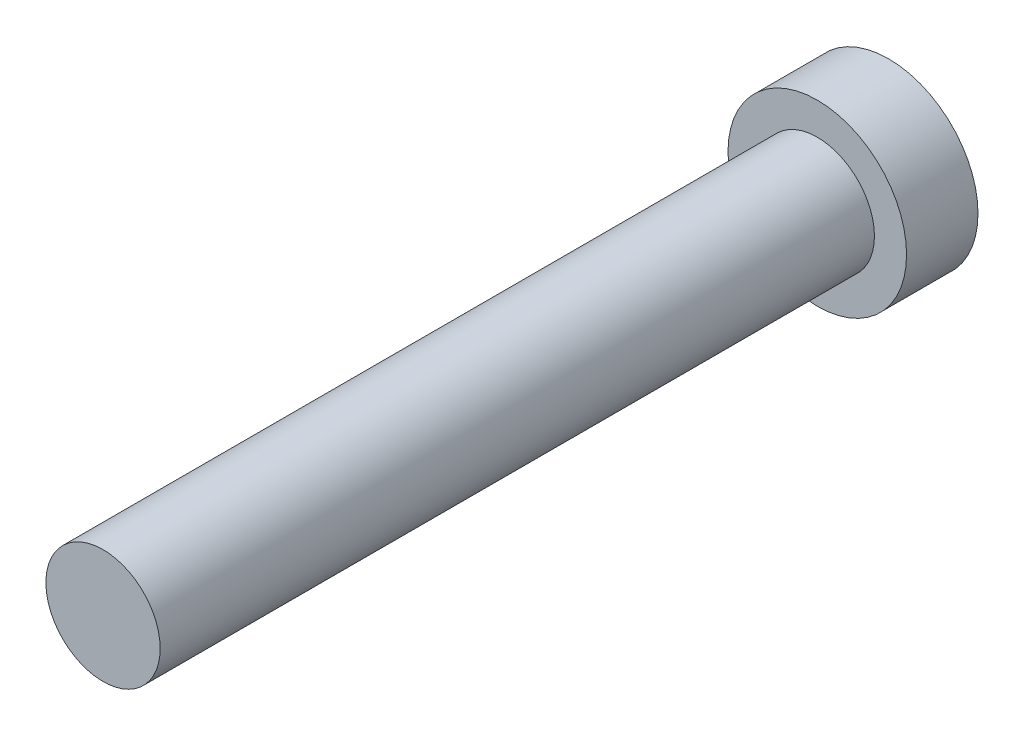
ISO-10303-21;
HEADER;
FILE_DESCRIPTION(('STEP AP214'),'2;1');
FILE_NAME('part.step','',(''),(''),'','','');
FILE_SCHEMA(('AUTOMOTIVE_DESIGN { 1 0 10303 214 1 1 1 1 }'));
ENDSEC;
DATA;
#1=APPLICATION_CONTEXT('core data for automotive mechanical design processes');
#2=APPLICATION_PROTOCOL_DEFINITION('international standard','automotive_design',2000,#1);
#3=PRODUCT_CONTEXT('',#1,'mechanical');
#4=PRODUCT('Part','Part','',(#3));
#5=PRODUCT_RELATED_PRODUCT_CATEGORY('part','',(#4));
#6=PRODUCT_DEFINITION_FORMATION('','',#4);
#7=PRODUCT_DEFINITION_CONTEXT('part definition',#1,'design');
#8=PRODUCT_DEFINITION('design','',#6,#7);
#9=PRODUCT_DEFINITION_SHAPE('','',#8);
#10=(LENGTH_UNIT() NAMED_UNIT(*) SI_UNIT(.MILLI.,.METRE.));
#11=(NAMED_UNIT(*) PLANE_ANGLE_UNIT() SI_UNIT($,.RADIAN.));
#12=(NAMED_UNIT(*) SI_UNIT($,.STERADIAN.) SOLID_ANGLE_UNIT());
#13=UNCERTAINTY_MEASURE_WITH_UNIT(LENGTH_MEASURE(1.E-05),#10,'distance_accuracy_value','');
#14=(GEOMETRIC_REPRESENTATION_CONTEXT(3) GLOBAL_UNCERTAINTY_ASSIGNED_CONTEXT((#13)) GLOBAL_UNIT_ASSIGNED_CONTEXT((#10,
#11,#12)) REPRESENTATION_CONTEXT('',''));
#15=CARTESIAN_POINT('',(0.,0.,0.));
#16=DIRECTION('',(0.,0.,1.));
#17=DIRECTION('',(1.,0.,0.));
#18=AXIS2_PLACEMENT_3D('',#15,#16,#17);
#19=CARTESIAN_POINT('',(0.,0.,10.));
#20=DIRECTION('',(0.,0.,-1.));
#21=DIRECTION('',(-1.,0.,0.));
#22=AXIS2_PLACEMENT_3D('',#19,#20,#21);
#23=CYLINDRICAL_SURFACE('',#22,1.6);
#24=CARTESIAN_POINT('',(0.,0.,10.));
#25=DIRECTION('',(0.,0.,1.));
#26=DIRECTION('',(1.,0.,0.));
#27=AXIS2_PLACEMENT_3D('',#24,#25,#26);
#28=CIRCLE('',#27,1.6);
#29=CARTESIAN_POINT('',(1.6,0.,10.));
#30=VERTEX_POINT('',#29);
#31=EDGE_CURVE('E10',#30,#30,#28,.T.);
#32=ORIENTED_EDGE('',*,*,#31,.F.);
#33=EDGE_LOOP('',(#32));
#34=FACE_BOUND('',#33,.T.);
#35=CARTESIAN_POINT('',(0.,0.,-10.));
#36=DIRECTION('',(0.,0.,1.));
#37=DIRECTION('',(1.,0.,0.));
#38=AXIS2_PLACEMENT_3D('',#35,#36,#37);
#39=CIRCLE('',#38,1.6);
#40=CARTESIAN_POINT('',(1.6,0.,-10.));
#41=VERTEX_POINT('',#40);
#42=EDGE_CURVE('E38',#41,#41,#39,.T.);
#43=ORIENTED_EDGE('',*,*,#42,.T.);
#44=EDGE_LOOP('',(#43));
#45=FACE_BOUND('',#44,.T.);
#46=ADVANCED_FACE('F35',(#34,#45),#23,.T.);
#47=CARTESIAN_POINT('',(0.,0.,10.));
#48=DIRECTION('',(0.,0.,1.));
#49=DIRECTION('',(1.,0.,0.));
#50=AXIS2_PLACEMENT_3D('',#47,#48,#49);
#51=PLANE('',#50);
#52=ORIENTED_EDGE('',*,*,#31,.T.);
#53=EDGE_LOOP('',(#52));
#54=FACE_BOUND('',#53,.T.);
#55=ADVANCED_FACE('F58',(#54),#51,.T.);
#56=CARTESIAN_POINT('',(0.,0.,-12.));
#57=DIRECTION('',(0.,0.,1.));
#58=DIRECTION('',(1.,0.,0.));
#59=AXIS2_PLACEMENT_3D('',#56,#57,#58);
#60=CYLINDRICAL_SURFACE('',#59,2.5);
#61=CARTESIAN_POINT('',(0.,0.,-12.));
#62=DIRECTION('',(0.,0.,-1.));
#63=DIRECTION('',(-1.,0.,0.));
#64=AXIS2_PLACEMENT_3D('',#61,#62,#63);
#65=CIRCLE('',#64,2.5);
#66=CARTESIAN_POINT('',(-2.5,0.,-12.));
#67=VERTEX_POINT('',#66);
#68=EDGE_CURVE('E45',#67,#67,#65,.T.);
#69=ORIENTED_EDGE('',*,*,#68,.F.);
#70=EDGE_LOOP('',(#69));
#71=FACE_BOUND('',#70,.T.);
#72=CARTESIAN_POINT('',(0.,0.,-10.));
#73=DIRECTION('',(0.,0.,-1.));
#74=DIRECTION('',(-1.,0.,0.));
#75=AXIS2_PLACEMENT_3D('',#72,#73,#74);
#76=CIRCLE('',#75,2.5);
#77=CARTESIAN_POINT('',(-2.5,0.,-10.));
#78=VERTEX_POINT('',#77);
#79=EDGE_CURVE('E47',#78,#78,#76,.T.);
#80=ORIENTED_EDGE('',*,*,#79,.T.);
#81=EDGE_LOOP('',(#80));
#82=FACE_BOUND('',#81,.T.);
#83=ADVANCED_FACE('F55',(#71,#82),#60,.T.);
#84=CARTESIAN_POINT('',(0.,0.,-12.));
#85=DIRECTION('',(0.,0.,-1.));
#86=DIRECTION('',(-1.,0.,0.));
#87=AXIS2_PLACEMENT_3D('',#84,#85,#86);
#88=PLANE('',#87);
#89=ORIENTED_EDGE('',*,*,#68,.T.);
#90=EDGE_LOOP('',(#89));
#91=FACE_BOUND('',#90,.T.);
#92=ADVANCED_FACE('F53',(#91),#88,.T.);
#93=CARTESIAN_POINT('',(0.,0.,-10.));
#94=DIRECTION('',(0.,0.,-1.));
#95=DIRECTION('',(-1.,0.,0.));
#96=AXIS2_PLACEMENT_3D('',#93,#94,#95);
#97=PLANE('',#96);
#98=ORIENTED_EDGE('',*,*,#42,.F.);
#99=EDGE_LOOP('',(#98));
#100=FACE_BOUND('',#99,.T.);
#101=ORIENTED_EDGE('',*,*,#79,.F.);
#102=EDGE_LOOP('',(#101));
#103=FACE_BOUND('',#102,.T.);
#104=ADVANCED_FACE('F62',(#100,#103),#97,.F.);
#105=CLOSED_SHELL('',(#46,#55,#83,#92,#104));
#106=MANIFOLD_SOLID_BREP('B2',#105);
#107=ADVANCED_BREP_SHAPE_REPRESENTATION('',(#18,#106),#14);
#108=SHAPE_DEFINITION_REPRESENTATION(#9,#107);
ENDSEC;
END-ISO-10303-21;
